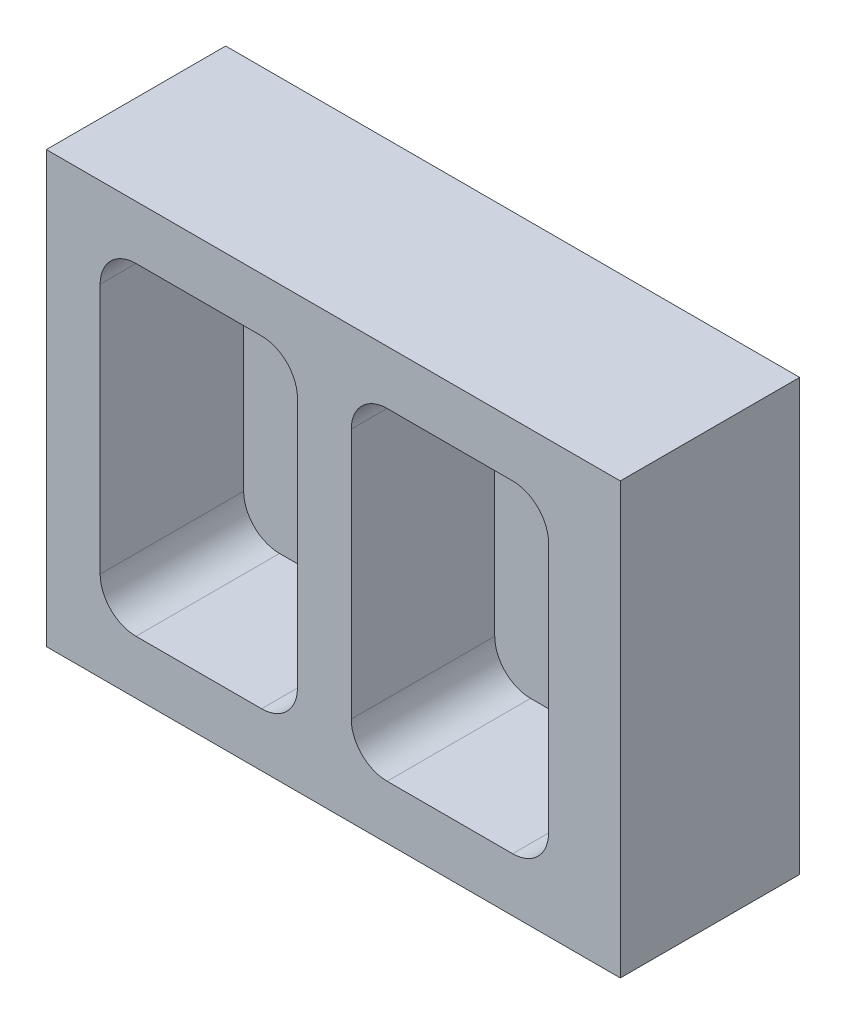
ISO-10303-21;
HEADER;
FILE_DESCRIPTION(('STEP AP214'),'2;1');
FILE_NAME('part.step','',(''),(''),'','','');
FILE_SCHEMA(('AUTOMOTIVE_DESIGN { 1 0 10303 214 1 1 1 1 }'));
ENDSEC;
DATA;
#1=APPLICATION_CONTEXT('core data for automotive mechanical design processes');
#2=APPLICATION_PROTOCOL_DEFINITION('international standard','automotive_design',2000,#1);
#3=PRODUCT_CONTEXT('',#1,'mechanical');
#4=PRODUCT('Part','Part','',(#3));
#5=PRODUCT_RELATED_PRODUCT_CATEGORY('part','',(#4));
#6=PRODUCT_DEFINITION_FORMATION('','',#4);
#7=PRODUCT_DEFINITION_CONTEXT('part definition',#1,'design');
#8=PRODUCT_DEFINITION('design','',#6,#7);
#9=PRODUCT_DEFINITION_SHAPE('','',#8);
#10=(LENGTH_UNIT() NAMED_UNIT(*) SI_UNIT(.MILLI.,.METRE.));
#11=(NAMED_UNIT(*) PLANE_ANGLE_UNIT() SI_UNIT($,.RADIAN.));
#12=(NAMED_UNIT(*) SI_UNIT($,.STERADIAN.) SOLID_ANGLE_UNIT());
#13=UNCERTAINTY_MEASURE_WITH_UNIT(LENGTH_MEASURE(1.E-05),#10,'distance_accuracy_value','');
#14=(GEOMETRIC_REPRESENTATION_CONTEXT(3) GLOBAL_UNCERTAINTY_ASSIGNED_CONTEXT((#13)) GLOBAL_UNIT_ASSIGNED_CONTEXT((#10,
#11,#12)) REPRESENTATION_CONTEXT('',''));
#15=CARTESIAN_POINT('',(0.,0.,0.));
#16=DIRECTION('',(0.,0.,1.));
#17=DIRECTION('',(1.,0.,0.));
#18=AXIS2_PLACEMENT_3D('',#15,#16,#17);
#19=CARTESIAN_POINT('',(-101.6,76.2,-63.5));
#20=DIRECTION('',(-1.,0.,0.));
#21=DIRECTION('',(0.,0.,1.));
#22=AXIS2_PLACEMENT_3D('',#19,#20,#21);
#23=PLANE('',#22);
#24=DIRECTION('',(0.,-1.,0.));
#25=VECTOR('',#24,1.);
#26=CARTESIAN_POINT('',(-101.6,76.2,0.));
#27=LINE('',#26,#25);
#28=CARTESIAN_POINT('',(-101.6,76.2,0.));
#29=VERTEX_POINT('',#28);
#30=CARTESIAN_POINT('',(-101.6,-76.2,0.));
#31=VERTEX_POINT('',#30);
#32=EDGE_CURVE('E293',#29,#31,#27,.T.);
#33=ORIENTED_EDGE('',*,*,#32,.F.);
#34=DIRECTION('',(0.,0.,1.));
#35=VECTOR('',#34,1.);
#36=CARTESIAN_POINT('',(-101.6,76.2,-63.5));
#37=LINE('',#36,#35);
#38=CARTESIAN_POINT('',(-101.6,76.2,-63.5));
#39=VERTEX_POINT('',#38);
#40=EDGE_CURVE('E11',#39,#29,#37,.T.);
#41=ORIENTED_EDGE('',*,*,#40,.F.);
#42=DIRECTION('',(0.,-1.,0.));
#43=VECTOR('',#42,1.);
#44=CARTESIAN_POINT('',(-101.6,76.2,-63.5));
#45=LINE('',#44,#43);
#46=CARTESIAN_POINT('',(-101.6,-76.2,-63.5));
#47=VERTEX_POINT('',#46);
#48=EDGE_CURVE('E318',#39,#47,#45,.T.);
#49=ORIENTED_EDGE('',*,*,#48,.T.);
#50=DIRECTION('',(0.,0.,1.));
#51=VECTOR('',#50,1.);
#52=CARTESIAN_POINT('',(-101.6,-76.2,-63.5));
#53=LINE('',#52,#51);
#54=EDGE_CURVE('E37',#47,#31,#53,.T.);
#55=ORIENTED_EDGE('',*,*,#54,.T.);
#56=EDGE_LOOP('',(#33,#41,#49,#55));
#57=FACE_BOUND('',#56,.T.);
#58=ADVANCED_FACE('F34',(#57),#23,.T.);
#59=CARTESIAN_POINT('',(-101.6,76.2,-63.5));
#60=DIRECTION('',(0.,1.,0.));
#61=DIRECTION('',(0.,0.,1.));
#62=AXIS2_PLACEMENT_3D('',#59,#60,#61);
#63=PLANE('',#62);
#64=DIRECTION('',(-1.,0.,0.));
#65=VECTOR('',#64,1.);
#66=CARTESIAN_POINT('',(-101.6,76.2,0.));
#67=LINE('',#66,#65);
#68=CARTESIAN_POINT('',(101.6,76.2,0.));
#69=VERTEX_POINT('',#68);
#70=EDGE_CURVE('E315',#69,#29,#67,.T.);
#71=ORIENTED_EDGE('',*,*,#70,.F.);
#72=DIRECTION('',(0.,0.,1.));
#73=VECTOR('',#72,1.);
#74=CARTESIAN_POINT('',(101.6,76.2,-63.5));
#75=LINE('',#74,#73);
#76=CARTESIAN_POINT('',(101.6,76.2,-63.5));
#77=VERTEX_POINT('',#76);
#78=EDGE_CURVE('E42',#77,#69,#75,.T.);
#79=ORIENTED_EDGE('',*,*,#78,.F.);
#80=DIRECTION('',(-1.,0.,0.));
#81=VECTOR('',#80,1.);
#82=CARTESIAN_POINT('',(-101.6,76.2,-63.5));
#83=LINE('',#82,#81);
#84=EDGE_CURVE('E327',#77,#39,#83,.T.);
#85=ORIENTED_EDGE('',*,*,#84,.T.);
#86=ORIENTED_EDGE('',*,*,#40,.T.);
#87=EDGE_LOOP('',(#71,#79,#85,#86));
#88=FACE_BOUND('',#87,.T.);
#89=ADVANCED_FACE('F342',(#88),#63,.T.);
#90=CARTESIAN_POINT('',(101.6,76.2,-63.5));
#91=DIRECTION('',(1.,0.,0.));
#92=DIRECTION('',(0.,0.,-1.));
#93=AXIS2_PLACEMENT_3D('',#90,#91,#92);
#94=PLANE('',#93);
#95=DIRECTION('',(0.,1.,0.));
#96=VECTOR('',#95,1.);
#97=CARTESIAN_POINT('',(101.6,76.2,0.));
#98=LINE('',#97,#96);
#99=CARTESIAN_POINT('',(101.6,-76.2,0.));
#100=VERTEX_POINT('',#99);
#101=EDGE_CURVE('E312',#100,#69,#98,.T.);
#102=ORIENTED_EDGE('',*,*,#101,.F.);
#103=DIRECTION('',(0.,0.,1.));
#104=VECTOR('',#103,1.);
#105=CARTESIAN_POINT('',(101.6,-76.2,-63.5));
#106=LINE('',#105,#104);
#107=CARTESIAN_POINT('',(101.6,-76.2,-63.5));
#108=VERTEX_POINT('',#107);
#109=EDGE_CURVE('E330',#108,#100,#106,.T.);
#110=ORIENTED_EDGE('',*,*,#109,.F.);
#111=DIRECTION('',(0.,1.,0.));
#112=VECTOR('',#111,1.);
#113=CARTESIAN_POINT('',(101.6,76.2,-63.5));
#114=LINE('',#113,#112);
#115=EDGE_CURVE('E324',#108,#77,#114,.T.);
#116=ORIENTED_EDGE('',*,*,#115,.T.);
#117=ORIENTED_EDGE('',*,*,#78,.T.);
#118=EDGE_LOOP('',(#102,#110,#116,#117));
#119=FACE_BOUND('',#118,.T.);
#120=ADVANCED_FACE('F348',(#119),#94,.T.);
#121=CARTESIAN_POINT('',(-101.6,-76.2,-63.5));
#122=DIRECTION('',(0.,-1.,0.));
#123=DIRECTION('',(0.,0.,-1.));
#124=AXIS2_PLACEMENT_3D('',#121,#122,#123);
#125=PLANE('',#124);
#126=DIRECTION('',(1.,0.,0.));
#127=VECTOR('',#126,1.);
#128=CARTESIAN_POINT('',(-101.6,-76.2,0.));
#129=LINE('',#128,#127);
#130=EDGE_CURVE('E309',#31,#100,#129,.T.);
#131=ORIENTED_EDGE('',*,*,#130,.F.);
#132=ORIENTED_EDGE('',*,*,#54,.F.);
#133=DIRECTION('',(1.,0.,0.));
#134=VECTOR('',#133,1.);
#135=CARTESIAN_POINT('',(-101.6,-76.2,-63.5));
#136=LINE('',#135,#134);
#137=EDGE_CURVE('E321',#47,#108,#136,.T.);
#138=ORIENTED_EDGE('',*,*,#137,.T.);
#139=ORIENTED_EDGE('',*,*,#109,.T.);
#140=EDGE_LOOP('',(#131,#132,#138,#139));
#141=FACE_BOUND('',#140,.T.);
#142=ADVANCED_FACE('F338',(#141),#125,.T.);
#143=CARTESIAN_POINT('',(-101.6,-76.2,-63.5));
#144=DIRECTION('',(0.,0.,1.));
#145=DIRECTION('',(1.,0.,0.));
#146=AXIS2_PLACEMENT_3D('',#143,#144,#145);
#147=PLANE('',#146);
#148=ORIENTED_EDGE('',*,*,#48,.F.);
#149=ORIENTED_EDGE('',*,*,#84,.F.);
#150=ORIENTED_EDGE('',*,*,#115,.F.);
#151=ORIENTED_EDGE('',*,*,#137,.F.);
#152=EDGE_LOOP('',(#148,#149,#150,#151));
#153=FACE_BOUND('',#152,.T.);
#154=ADVANCED_FACE('F345',(#153),#147,.F.);
#155=CARTESIAN_POINT('',(-101.6,-76.2,0.));
#156=DIRECTION('',(0.,0.,1.));
#157=DIRECTION('',(1.,0.,0.));
#158=AXIS2_PLACEMENT_3D('',#155,#156,#157);
#159=PLANE('',#158);
#160=CARTESIAN_POINT('',(19.05,-44.45,0.));
#161=DIRECTION('',(0.,0.,1.));
#162=DIRECTION('',(-1.,0.,0.));
#163=AXIS2_PLACEMENT_3D('',#160,#161,#162);
#164=CIRCLE('',#163,12.7);
#165=CARTESIAN_POINT('',(6.35,-44.4499999999999,0.));
#166=VERTEX_POINT('',#165);
#167=CARTESIAN_POINT('',(19.0500000000001,-57.15,0.));
#168=VERTEX_POINT('',#167);
#169=EDGE_CURVE('E50',#166,#168,#164,.T.);
#170=ORIENTED_EDGE('',*,*,#169,.F.);
#171=DIRECTION('',(0.,-1.,0.));
#172=VECTOR('',#171,1.);
#173=CARTESIAN_POINT('',(6.35,44.4499999999999,0.));
#174=LINE('',#173,#172);
#175=CARTESIAN_POINT('',(6.35,44.4499999999999,0.));
#176=VERTEX_POINT('',#175);
#177=EDGE_CURVE('E208',#176,#166,#174,.T.);
#178=ORIENTED_EDGE('',*,*,#177,.F.);
#179=CARTESIAN_POINT('',(19.05,44.45,0.));
#180=DIRECTION('',(0.,0.,1.));
#181=DIRECTION('',(-1.,0.,0.));
#182=AXIS2_PLACEMENT_3D('',#179,#180,#181);
#183=CIRCLE('',#182,12.7);
#184=CARTESIAN_POINT('',(19.0500000000001,57.15,0.));
#185=VERTEX_POINT('',#184);
#186=EDGE_CURVE('E205',#185,#176,#183,.T.);
#187=ORIENTED_EDGE('',*,*,#186,.F.);
#188=DIRECTION('',(-1.,0.,0.));
#189=VECTOR('',#188,1.);
#190=CARTESIAN_POINT('',(19.0500000000001,57.15,0.));
#191=LINE('',#190,#189);
#192=CARTESIAN_POINT('',(63.5,57.15,0.));
#193=VERTEX_POINT('',#192);
#194=EDGE_CURVE('E202',#193,#185,#191,.T.);
#195=ORIENTED_EDGE('',*,*,#194,.F.);
#196=CARTESIAN_POINT('',(63.5,44.45,0.));
#197=DIRECTION('',(0.,0.,1.));
#198=DIRECTION('',(1.,0.,0.));
#199=AXIS2_PLACEMENT_3D('',#196,#197,#198);
#200=CIRCLE('',#199,12.7);
#201=CARTESIAN_POINT('',(76.2,44.45,0.));
#202=VERTEX_POINT('',#201);
#203=EDGE_CURVE('E196',#202,#193,#200,.T.);
#204=ORIENTED_EDGE('',*,*,#203,.F.);
#205=DIRECTION('',(0.,1.,0.));
#206=VECTOR('',#205,1.);
#207=CARTESIAN_POINT('',(76.2,44.45,0.));
#208=LINE('',#207,#206);
#209=CARTESIAN_POINT('',(76.2,-44.45,0.));
#210=VERTEX_POINT('',#209);
#211=EDGE_CURVE('E194',#210,#202,#208,.T.);
#212=ORIENTED_EDGE('',*,*,#211,.F.);
#213=CARTESIAN_POINT('',(63.5,-44.45,0.));
#214=DIRECTION('',(0.,0.,1.));
#215=DIRECTION('',(-1.,0.,0.));
#216=AXIS2_PLACEMENT_3D('',#213,#214,#215);
#217=CIRCLE('',#216,12.7);
#218=CARTESIAN_POINT('',(63.5,-57.15,0.));
#219=VERTEX_POINT('',#218);
#220=EDGE_CURVE('E175',#219,#210,#217,.T.);
#221=ORIENTED_EDGE('',*,*,#220,.F.);
#222=DIRECTION('',(1.,0.,0.));
#223=VECTOR('',#222,1.);
#224=CARTESIAN_POINT('',(19.0500000000001,-57.15,0.));
#225=LINE('',#224,#223);
#226=EDGE_CURVE('E186',#168,#219,#225,.T.);
#227=ORIENTED_EDGE('',*,*,#226,.F.);
#228=EDGE_LOOP('',(#170,#178,#187,#195,#204,#212,#221,#227));
#229=FACE_BOUND('',#228,.T.);
#230=CARTESIAN_POINT('',(-69.85,44.45,0.));
#231=DIRECTION('',(0.,0.,1.));
#232=DIRECTION('',(-1.,0.,0.));
#233=AXIS2_PLACEMENT_3D('',#230,#231,#232);
#234=CIRCLE('',#233,12.7);
#235=CARTESIAN_POINT('',(-69.8499999999999,57.15,0.));
#236=VERTEX_POINT('',#235);
#237=CARTESIAN_POINT('',(-82.55,44.4499999999999,0.));
#238=VERTEX_POINT('',#237);
#239=EDGE_CURVE('E58',#236,#238,#234,.T.);
#240=ORIENTED_EDGE('',*,*,#239,.F.);
#241=DIRECTION('',(-1.,0.,0.));
#242=VECTOR('',#241,1.);
#243=CARTESIAN_POINT('',(-69.8499999999999,57.15,0.));
#244=LINE('',#243,#242);
#245=CARTESIAN_POINT('',(-25.4000000000001,57.15,0.));
#246=VERTEX_POINT('',#245);
#247=EDGE_CURVE('E263',#246,#236,#244,.T.);
#248=ORIENTED_EDGE('',*,*,#247,.F.);
#249=CARTESIAN_POINT('',(-25.4,44.45,0.));
#250=DIRECTION('',(0.,0.,1.));
#251=DIRECTION('',(1.,0.,0.));
#252=AXIS2_PLACEMENT_3D('',#249,#250,#251);
#253=CIRCLE('',#252,12.7);
#254=CARTESIAN_POINT('',(-12.7,44.4499999999999,0.));
#255=VERTEX_POINT('',#254);
#256=EDGE_CURVE('E260',#255,#246,#253,.T.);
#257=ORIENTED_EDGE('',*,*,#256,.F.);
#258=DIRECTION('',(0.,1.,0.));
#259=VECTOR('',#258,1.);
#260=CARTESIAN_POINT('',(-12.7,44.4499999999999,0.));
#261=LINE('',#260,#259);
#262=CARTESIAN_POINT('',(-12.7,-44.4499999999999,0.));
#263=VERTEX_POINT('',#262);
#264=EDGE_CURVE('E257',#263,#255,#261,.T.);
#265=ORIENTED_EDGE('',*,*,#264,.F.);
#266=CARTESIAN_POINT('',(-25.4,-44.45,0.));
#267=DIRECTION('',(0.,0.,1.));
#268=DIRECTION('',(-1.,0.,0.));
#269=AXIS2_PLACEMENT_3D('',#266,#267,#268);
#270=CIRCLE('',#269,12.7);
#271=CARTESIAN_POINT('',(-25.4000000000001,-57.15,0.));
#272=VERTEX_POINT('',#271);
#273=EDGE_CURVE('E254',#272,#263,#270,.T.);
#274=ORIENTED_EDGE('',*,*,#273,.F.);
#275=DIRECTION('',(1.,0.,0.));
#276=VECTOR('',#275,1.);
#277=CARTESIAN_POINT('',(-69.8499999999999,-57.15,0.));
#278=LINE('',#277,#276);
#279=CARTESIAN_POINT('',(-69.8499999999999,-57.15,0.));
#280=VERTEX_POINT('',#279);
#281=EDGE_CURVE('E251',#280,#272,#278,.T.);
#282=ORIENTED_EDGE('',*,*,#281,.F.);
#283=CARTESIAN_POINT('',(-69.85,-44.45,0.));
#284=DIRECTION('',(0.,0.,1.));
#285=DIRECTION('',(-1.,0.,0.));
#286=AXIS2_PLACEMENT_3D('',#283,#284,#285);
#287=CIRCLE('',#286,12.7);
#288=CARTESIAN_POINT('',(-82.55,-44.4499999999999,0.));
#289=VERTEX_POINT('',#288);
#290=EDGE_CURVE('E248',#289,#280,#287,.T.);
#291=ORIENTED_EDGE('',*,*,#290,.F.);
#292=DIRECTION('',(0.,-1.,0.));
#293=VECTOR('',#292,1.);
#294=CARTESIAN_POINT('',(-82.55,44.4499999999999,0.));
#295=LINE('',#294,#293);
#296=EDGE_CURVE('E245',#238,#289,#295,.T.);
#297=ORIENTED_EDGE('',*,*,#296,.F.);
#298=EDGE_LOOP('',(#240,#248,#257,#265,#274,#282,#291,#297));
#299=FACE_BOUND('',#298,.T.);
#300=ORIENTED_EDGE('',*,*,#32,.T.);
#301=ORIENTED_EDGE('',*,*,#130,.T.);
#302=ORIENTED_EDGE('',*,*,#101,.T.);
#303=ORIENTED_EDGE('',*,*,#70,.T.);
#304=EDGE_LOOP('',(#300,#301,#302,#303));
#305=FACE_BOUND('',#304,.T.);
#306=ADVANCED_FACE('F190',(#229,#299,#305),#159,.T.);
#307=CARTESIAN_POINT('',(-69.85,44.45,-50.8));
#308=DIRECTION('',(0.,0.,1.));
#309=DIRECTION('',(1.,0.,0.));
#310=AXIS2_PLACEMENT_3D('',#307,#308,#309);
#311=CYLINDRICAL_SURFACE('',#310,12.7);
#312=ORIENTED_EDGE('',*,*,#239,.T.);
#313=DIRECTION('',(0.,0.,1.));
#314=VECTOR('',#313,1.);
#315=CARTESIAN_POINT('',(-82.55,44.4499999999999,-50.8));
#316=LINE('',#315,#314);
#317=CARTESIAN_POINT('',(-82.55,44.4499999999999,-50.8));
#318=VERTEX_POINT('',#317);
#319=EDGE_CURVE('E290',#318,#238,#316,.T.);
#320=ORIENTED_EDGE('',*,*,#319,.F.);
#321=CARTESIAN_POINT('',(-69.85,44.45,-50.8));
#322=DIRECTION('',(0.,0.,1.));
#323=DIRECTION('',(-1.,0.,0.));
#324=AXIS2_PLACEMENT_3D('',#321,#322,#323);
#325=CIRCLE('',#324,12.7);
#326=CARTESIAN_POINT('',(-69.8499999999999,57.15,-50.8));
#327=VERTEX_POINT('',#326);
#328=EDGE_CURVE('E266',#327,#318,#325,.T.);
#329=ORIENTED_EDGE('',*,*,#328,.F.);
#330=DIRECTION('',(0.,0.,1.));
#331=VECTOR('',#330,1.);
#332=CARTESIAN_POINT('',(-69.8499999999999,57.15,-50.8));
#333=LINE('',#332,#331);
#334=EDGE_CURVE('E291',#327,#236,#333,.T.);
#335=ORIENTED_EDGE('',*,*,#334,.T.);
#336=EDGE_LOOP('',(#312,#320,#329,#335));
#337=FACE_BOUND('',#336,.T.);
#338=ADVANCED_FACE('F391',(#337),#311,.F.);
#339=CARTESIAN_POINT('',(-69.8499999999999,57.15,-50.8));
#340=DIRECTION('',(0.,1.,0.));
#341=DIRECTION('',(0.,0.,1.));
#342=AXIS2_PLACEMENT_3D('',#339,#340,#341);
#343=PLANE('',#342);
#344=ORIENTED_EDGE('',*,*,#247,.T.);
#345=ORIENTED_EDGE('',*,*,#334,.F.);
#346=DIRECTION('',(-1.,0.,0.));
#347=VECTOR('',#346,1.);
#348=CARTESIAN_POINT('',(-69.8499999999999,57.15,-50.8));
#349=LINE('',#348,#347);
#350=CARTESIAN_POINT('',(-25.4000000000001,57.15,-50.8));
#351=VERTEX_POINT('',#350);
#352=EDGE_CURVE('E287',#351,#327,#349,.T.);
#353=ORIENTED_EDGE('',*,*,#352,.F.);
#354=DIRECTION('',(0.,0.,1.));
#355=VECTOR('',#354,1.);
#356=CARTESIAN_POINT('',(-25.4000000000001,57.15,-50.8));
#357=LINE('',#356,#355);
#358=EDGE_CURVE('E294',#351,#246,#357,.T.);
#359=ORIENTED_EDGE('',*,*,#358,.T.);
#360=EDGE_LOOP('',(#344,#345,#353,#359));
#361=FACE_BOUND('',#360,.T.);
#362=ADVANCED_FACE('F399',(#361),#343,.F.);
#363=CARTESIAN_POINT('',(-25.4,44.45,-50.8));
#364=DIRECTION('',(0.,0.,1.));
#365=DIRECTION('',(1.,0.,0.));
#366=AXIS2_PLACEMENT_3D('',#363,#364,#365);
#367=CYLINDRICAL_SURFACE('',#366,12.7);
#368=ORIENTED_EDGE('',*,*,#256,.T.);
#369=ORIENTED_EDGE('',*,*,#358,.F.);
#370=CARTESIAN_POINT('',(-25.4,44.45,-50.8));
#371=DIRECTION('',(0.,0.,1.));
#372=DIRECTION('',(1.,0.,0.));
#373=AXIS2_PLACEMENT_3D('',#370,#371,#372);
#374=CIRCLE('',#373,12.7);
#375=CARTESIAN_POINT('',(-12.7,44.4499999999999,-50.8));
#376=VERTEX_POINT('',#375);
#377=EDGE_CURVE('E284',#376,#351,#374,.T.);
#378=ORIENTED_EDGE('',*,*,#377,.F.);
#379=DIRECTION('',(0.,0.,1.));
#380=VECTOR('',#379,1.);
#381=CARTESIAN_POINT('',(-12.7,44.4499999999999,-50.8));
#382=LINE('',#381,#380);
#383=EDGE_CURVE('E296',#376,#255,#382,.T.);
#384=ORIENTED_EDGE('',*,*,#383,.T.);
#385=EDGE_LOOP('',(#368,#369,#378,#384));
#386=FACE_BOUND('',#385,.T.);
#387=ADVANCED_FACE('F408',(#386),#367,.F.);
#388=CARTESIAN_POINT('',(-12.7,44.4499999999999,-50.8));
#389=DIRECTION('',(1.,0.,0.));
#390=DIRECTION('',(0.,0.,-1.));
#391=AXIS2_PLACEMENT_3D('',#388,#389,#390);
#392=PLANE('',#391);
#393=ORIENTED_EDGE('',*,*,#264,.T.);
#394=ORIENTED_EDGE('',*,*,#383,.F.);
#395=DIRECTION('',(0.,1.,0.));
#396=VECTOR('',#395,1.);
#397=CARTESIAN_POINT('',(-12.7,44.4499999999999,-50.8));
#398=LINE('',#397,#396);
#399=CARTESIAN_POINT('',(-12.7,-44.4499999999999,-50.8));
#400=VERTEX_POINT('',#399);
#401=EDGE_CURVE('E281',#400,#376,#398,.T.);
#402=ORIENTED_EDGE('',*,*,#401,.F.);
#403=DIRECTION('',(0.,0.,1.));
#404=VECTOR('',#403,1.);
#405=CARTESIAN_POINT('',(-12.7,-44.4499999999999,-50.8));
#406=LINE('',#405,#404);
#407=EDGE_CURVE('E298',#400,#263,#406,.T.);
#408=ORIENTED_EDGE('',*,*,#407,.T.);
#409=EDGE_LOOP('',(#393,#394,#402,#408));
#410=FACE_BOUND('',#409,.T.);
#411=ADVANCED_FACE('F418',(#410),#392,.F.);
#412=CARTESIAN_POINT('',(-25.4,-44.45,-50.8));
#413=DIRECTION('',(0.,0.,1.));
#414=DIRECTION('',(1.,0.,0.));
#415=AXIS2_PLACEMENT_3D('',#412,#413,#414);
#416=CYLINDRICAL_SURFACE('',#415,12.7);
#417=ORIENTED_EDGE('',*,*,#273,.T.);
#418=ORIENTED_EDGE('',*,*,#407,.F.);
#419=CARTESIAN_POINT('',(-25.4,-44.45,-50.8));
#420=DIRECTION('',(0.,0.,1.));
#421=DIRECTION('',(-1.,0.,0.));
#422=AXIS2_PLACEMENT_3D('',#419,#420,#421);
#423=CIRCLE('',#422,12.7);
#424=CARTESIAN_POINT('',(-25.4000000000001,-57.15,-50.8));
#425=VERTEX_POINT('',#424);
#426=EDGE_CURVE('E278',#425,#400,#423,.T.);
#427=ORIENTED_EDGE('',*,*,#426,.F.);
#428=DIRECTION('',(0.,0.,1.));
#429=VECTOR('',#428,1.);
#430=CARTESIAN_POINT('',(-25.4000000000001,-57.15,-50.8));
#431=LINE('',#430,#429);
#432=EDGE_CURVE('E300',#425,#272,#431,.T.);
#433=ORIENTED_EDGE('',*,*,#432,.T.);
#434=EDGE_LOOP('',(#417,#418,#427,#433));
#435=FACE_BOUND('',#434,.T.);
#436=ADVANCED_FACE('F428',(#435),#416,.F.);
#437=CARTESIAN_POINT('',(-69.8499999999999,-57.15,-50.8));
#438=DIRECTION('',(0.,-1.,0.));
#439=DIRECTION('',(0.,0.,-1.));
#440=AXIS2_PLACEMENT_3D('',#437,#438,#439);
#441=PLANE('',#440);
#442=ORIENTED_EDGE('',*,*,#281,.T.);
#443=ORIENTED_EDGE('',*,*,#432,.F.);
#444=DIRECTION('',(1.,0.,0.));
#445=VECTOR('',#444,1.);
#446=CARTESIAN_POINT('',(-69.8499999999999,-57.15,-50.8));
#447=LINE('',#446,#445);
#448=CARTESIAN_POINT('',(-69.8499999999999,-57.15,-50.8));
#449=VERTEX_POINT('',#448);
#450=EDGE_CURVE('E275',#449,#425,#447,.T.);
#451=ORIENTED_EDGE('',*,*,#450,.F.);
#452=DIRECTION('',(0.,0.,1.));
#453=VECTOR('',#452,1.);
#454=CARTESIAN_POINT('',(-69.8499999999999,-57.15,-50.8));
#455=LINE('',#454,#453);
#456=EDGE_CURVE('E302',#449,#280,#455,.T.);
#457=ORIENTED_EDGE('',*,*,#456,.T.);
#458=EDGE_LOOP('',(#442,#443,#451,#457));
#459=FACE_BOUND('',#458,.T.);
#460=ADVANCED_FACE('F438',(#459),#441,.F.);
#461=CARTESIAN_POINT('',(-69.85,-44.45,-50.8));
#462=DIRECTION('',(0.,0.,1.));
#463=DIRECTION('',(1.,0.,0.));
#464=AXIS2_PLACEMENT_3D('',#461,#462,#463);
#465=CYLINDRICAL_SURFACE('',#464,12.7);
#466=ORIENTED_EDGE('',*,*,#290,.T.);
#467=ORIENTED_EDGE('',*,*,#456,.F.);
#468=CARTESIAN_POINT('',(-69.85,-44.45,-50.8));
#469=DIRECTION('',(0.,0.,1.));
#470=DIRECTION('',(-1.,0.,0.));
#471=AXIS2_PLACEMENT_3D('',#468,#469,#470);
#472=CIRCLE('',#471,12.7);
#473=CARTESIAN_POINT('',(-82.55,-44.4499999999999,-50.8));
#474=VERTEX_POINT('',#473);
#475=EDGE_CURVE('E272',#474,#449,#472,.T.);
#476=ORIENTED_EDGE('',*,*,#475,.F.);
#477=DIRECTION('',(0.,0.,1.));
#478=VECTOR('',#477,1.);
#479=CARTESIAN_POINT('',(-82.55,-44.4499999999999,-50.8));
#480=LINE('',#479,#478);
#481=EDGE_CURVE('E304',#474,#289,#480,.T.);
#482=ORIENTED_EDGE('',*,*,#481,.T.);
#483=EDGE_LOOP('',(#466,#467,#476,#482));
#484=FACE_BOUND('',#483,.T.);
#485=ADVANCED_FACE('F448',(#484),#465,.F.);
#486=CARTESIAN_POINT('',(-82.55,44.4499999999999,-50.8));
#487=DIRECTION('',(-1.,0.,0.));
#488=DIRECTION('',(0.,0.,1.));
#489=AXIS2_PLACEMENT_3D('',#486,#487,#488);
#490=PLANE('',#489);
#491=ORIENTED_EDGE('',*,*,#296,.T.);
#492=ORIENTED_EDGE('',*,*,#481,.F.);
#493=DIRECTION('',(0.,-1.,0.));
#494=VECTOR('',#493,1.);
#495=CARTESIAN_POINT('',(-82.55,44.4499999999999,-50.8));
#496=LINE('',#495,#494);
#497=EDGE_CURVE('E269',#318,#474,#496,.T.);
#498=ORIENTED_EDGE('',*,*,#497,.F.);
#499=ORIENTED_EDGE('',*,*,#319,.T.);
#500=EDGE_LOOP('',(#491,#492,#498,#499));
#501=FACE_BOUND('',#500,.T.);
#502=ADVANCED_FACE('F458',(#501),#490,.F.);
#503=CARTESIAN_POINT('',(-69.85,44.45,-50.8));
#504=DIRECTION('',(0.,0.,-1.));
#505=DIRECTION('',(-1.,0.,0.));
#506=AXIS2_PLACEMENT_3D('',#503,#504,#505);
#507=PLANE('',#506);
#508=ORIENTED_EDGE('',*,*,#328,.T.);
#509=ORIENTED_EDGE('',*,*,#497,.T.);
#510=ORIENTED_EDGE('',*,*,#475,.T.);
#511=ORIENTED_EDGE('',*,*,#450,.T.);
#512=ORIENTED_EDGE('',*,*,#426,.T.);
#513=ORIENTED_EDGE('',*,*,#401,.T.);
#514=ORIENTED_EDGE('',*,*,#377,.T.);
#515=ORIENTED_EDGE('',*,*,#352,.T.);
#516=EDGE_LOOP('',(#508,#509,#510,#511,#512,#513,#514,#515));
#517=FACE_BOUND('',#516,.T.);
#518=ADVANCED_FACE('F468',(#517),#507,.F.);
#519=CARTESIAN_POINT('',(19.05,-44.45,-50.8));
#520=DIRECTION('',(0.,0.,1.));
#521=DIRECTION('',(1.,0.,0.));
#522=AXIS2_PLACEMENT_3D('',#519,#520,#521);
#523=CYLINDRICAL_SURFACE('',#522,12.7);
#524=ORIENTED_EDGE('',*,*,#169,.T.);
#525=DIRECTION('',(0.,0.,1.));
#526=VECTOR('',#525,1.);
#527=CARTESIAN_POINT('',(19.0500000000001,-57.15,-50.8));
#528=LINE('',#527,#526);
#529=CARTESIAN_POINT('',(19.0500000000001,-57.15,-50.8));
#530=VERTEX_POINT('',#529);
#531=EDGE_CURVE('E183',#530,#168,#528,.T.);
#532=ORIENTED_EDGE('',*,*,#531,.F.);
#533=CARTESIAN_POINT('',(19.05,-44.45,-50.8));
#534=DIRECTION('',(0.,0.,1.));
#535=DIRECTION('',(-1.,0.,0.));
#536=AXIS2_PLACEMENT_3D('',#533,#534,#535);
#537=CIRCLE('',#536,12.7);
#538=CARTESIAN_POINT('',(6.35,-44.4499999999999,-50.8));
#539=VERTEX_POINT('',#538);
#540=EDGE_CURVE('E211',#539,#530,#537,.T.);
#541=ORIENTED_EDGE('',*,*,#540,.F.);
#542=DIRECTION('',(0.,0.,1.));
#543=VECTOR('',#542,1.);
#544=CARTESIAN_POINT('',(6.35,-44.4499999999999,-50.8));
#545=LINE('',#544,#543);
#546=EDGE_CURVE('E232',#539,#166,#545,.T.);
#547=ORIENTED_EDGE('',*,*,#546,.T.);
#548=EDGE_LOOP('',(#524,#532,#541,#547));
#549=FACE_BOUND('',#548,.T.);
#550=ADVANCED_FACE('F478',(#549),#523,.F.);
#551=CARTESIAN_POINT('',(6.35,44.4499999999999,-50.8));
#552=DIRECTION('',(-1.,0.,0.));
#553=DIRECTION('',(0.,0.,1.));
#554=AXIS2_PLACEMENT_3D('',#551,#552,#553);
#555=PLANE('',#554);
#556=ORIENTED_EDGE('',*,*,#177,.T.);
#557=ORIENTED_EDGE('',*,*,#546,.F.);
#558=DIRECTION('',(0.,-1.,0.));
#559=VECTOR('',#558,1.);
#560=CARTESIAN_POINT('',(6.35,44.4499999999999,-50.8));
#561=LINE('',#560,#559);
#562=CARTESIAN_POINT('',(6.35,44.4499999999999,-50.8));
#563=VERTEX_POINT('',#562);
#564=EDGE_CURVE('E229',#563,#539,#561,.T.);
#565=ORIENTED_EDGE('',*,*,#564,.F.);
#566=DIRECTION('',(0.,0.,1.));
#567=VECTOR('',#566,1.);
#568=CARTESIAN_POINT('',(6.35,44.4499999999999,-50.8));
#569=LINE('',#568,#567);
#570=EDGE_CURVE('E234',#563,#176,#569,.T.);
#571=ORIENTED_EDGE('',*,*,#570,.T.);
#572=EDGE_LOOP('',(#556,#557,#565,#571));
#573=FACE_BOUND('',#572,.T.);
#574=ADVANCED_FACE('F488',(#573),#555,.F.);
#575=CARTESIAN_POINT('',(19.05,44.45,-50.8));
#576=DIRECTION('',(0.,0.,1.));
#577=DIRECTION('',(1.,0.,0.));
#578=AXIS2_PLACEMENT_3D('',#575,#576,#577);
#579=CYLINDRICAL_SURFACE('',#578,12.7);
#580=ORIENTED_EDGE('',*,*,#186,.T.);
#581=ORIENTED_EDGE('',*,*,#570,.F.);
#582=CARTESIAN_POINT('',(19.05,44.45,-50.8));
#583=DIRECTION('',(0.,0.,1.));
#584=DIRECTION('',(-1.,0.,0.));
#585=AXIS2_PLACEMENT_3D('',#582,#583,#584);
#586=CIRCLE('',#585,12.7);
#587=CARTESIAN_POINT('',(19.0500000000001,57.15,-50.8));
#588=VERTEX_POINT('',#587);
#589=EDGE_CURVE('E226',#588,#563,#586,.T.);
#590=ORIENTED_EDGE('',*,*,#589,.F.);
#591=DIRECTION('',(0.,0.,1.));
#592=VECTOR('',#591,1.);
#593=CARTESIAN_POINT('',(19.0500000000001,57.15,-50.8));
#594=LINE('',#593,#592);
#595=EDGE_CURVE('E236',#588,#185,#594,.T.);
#596=ORIENTED_EDGE('',*,*,#595,.T.);
#597=EDGE_LOOP('',(#580,#581,#590,#596));
#598=FACE_BOUND('',#597,.T.);
#599=ADVANCED_FACE('F497',(#598),#579,.F.);
#600=CARTESIAN_POINT('',(19.0500000000001,57.15,-50.8));
#601=DIRECTION('',(0.,1.,0.));
#602=DIRECTION('',(-1.,0.,0.));
#603=AXIS2_PLACEMENT_3D('',#600,#601,#602);
#604=PLANE('',#603);
#605=ORIENTED_EDGE('',*,*,#194,.T.);
#606=ORIENTED_EDGE('',*,*,#595,.F.);
#607=DIRECTION('',(-1.,0.,0.));
#608=VECTOR('',#607,1.);
#609=CARTESIAN_POINT('',(19.0500000000001,57.15,-50.8));
#610=LINE('',#609,#608);
#611=CARTESIAN_POINT('',(63.5,57.15,-50.8));
#612=VERTEX_POINT('',#611);
#613=EDGE_CURVE('E223',#612,#588,#610,.T.);
#614=ORIENTED_EDGE('',*,*,#613,.F.);
#615=DIRECTION('',(0.,0.,1.));
#616=VECTOR('',#615,1.);
#617=CARTESIAN_POINT('',(63.5,57.15,-50.8));
#618=LINE('',#617,#616);
#619=EDGE_CURVE('E238',#612,#193,#618,.T.);
#620=ORIENTED_EDGE('',*,*,#619,.T.);
#621=EDGE_LOOP('',(#605,#606,#614,#620));
#622=FACE_BOUND('',#621,.T.);
#623=ADVANCED_FACE('F507',(#622),#604,.F.);
#624=CARTESIAN_POINT('',(63.5,44.45,-50.8));
#625=DIRECTION('',(0.,0.,1.));
#626=DIRECTION('',(1.,0.,0.));
#627=AXIS2_PLACEMENT_3D('',#624,#625,#626);
#628=CYLINDRICAL_SURFACE('',#627,12.7);
#629=ORIENTED_EDGE('',*,*,#203,.T.);
#630=ORIENTED_EDGE('',*,*,#619,.F.);
#631=CARTESIAN_POINT('',(63.5,44.45,-50.8));
#632=DIRECTION('',(0.,0.,1.));
#633=DIRECTION('',(1.,0.,0.));
#634=AXIS2_PLACEMENT_3D('',#631,#632,#633);
#635=CIRCLE('',#634,12.7);
#636=CARTESIAN_POINT('',(76.2,44.45,-50.8));
#637=VERTEX_POINT('',#636);
#638=EDGE_CURVE('E220',#637,#612,#635,.T.);
#639=ORIENTED_EDGE('',*,*,#638,.F.);
#640=DIRECTION('',(0.,0.,1.));
#641=VECTOR('',#640,1.);
#642=CARTESIAN_POINT('',(76.2,44.45,-50.8));
#643=LINE('',#642,#641);
#644=EDGE_CURVE('E240',#637,#202,#643,.T.);
#645=ORIENTED_EDGE('',*,*,#644,.T.);
#646=EDGE_LOOP('',(#629,#630,#639,#645));
#647=FACE_BOUND('',#646,.T.);
#648=ADVANCED_FACE('F517',(#647),#628,.F.);
#649=CARTESIAN_POINT('',(76.2,44.45,-50.8));
#650=DIRECTION('',(1.,0.,0.));
#651=DIRECTION('',(0.,0.,-1.));
#652=AXIS2_PLACEMENT_3D('',#649,#650,#651);
#653=PLANE('',#652);
#654=ORIENTED_EDGE('',*,*,#211,.T.);
#655=ORIENTED_EDGE('',*,*,#644,.F.);
#656=DIRECTION('',(0.,1.,0.));
#657=VECTOR('',#656,1.);
#658=CARTESIAN_POINT('',(76.2,44.45,-50.8));
#659=LINE('',#658,#657);
#660=CARTESIAN_POINT('',(76.2,-44.45,-50.8));
#661=VERTEX_POINT('',#660);
#662=EDGE_CURVE('E217',#661,#637,#659,.T.);
#663=ORIENTED_EDGE('',*,*,#662,.F.);
#664=DIRECTION('',(0.,0.,1.));
#665=VECTOR('',#664,1.);
#666=CARTESIAN_POINT('',(76.2,-44.45,-50.8));
#667=LINE('',#666,#665);
#668=EDGE_CURVE('E182',#661,#210,#667,.T.);
#669=ORIENTED_EDGE('',*,*,#668,.T.);
#670=EDGE_LOOP('',(#654,#655,#663,#669));
#671=FACE_BOUND('',#670,.T.);
#672=ADVANCED_FACE('F527',(#671),#653,.F.);
#673=CARTESIAN_POINT('',(63.5,-44.45,-50.8));
#674=DIRECTION('',(0.,0.,1.));
#675=DIRECTION('',(1.,0.,0.));
#676=AXIS2_PLACEMENT_3D('',#673,#674,#675);
#677=CYLINDRICAL_SURFACE('',#676,12.7);
#678=ORIENTED_EDGE('',*,*,#220,.T.);
#679=ORIENTED_EDGE('',*,*,#668,.F.);
#680=CARTESIAN_POINT('',(63.5,-44.45,-50.8));
#681=DIRECTION('',(0.,0.,1.));
#682=DIRECTION('',(-1.,0.,0.));
#683=AXIS2_PLACEMENT_3D('',#680,#681,#682);
#684=CIRCLE('',#683,12.7);
#685=CARTESIAN_POINT('',(63.5,-57.15,-50.8));
#686=VERTEX_POINT('',#685);
#687=EDGE_CURVE('E178',#686,#661,#684,.T.);
#688=ORIENTED_EDGE('',*,*,#687,.F.);
#689=DIRECTION('',(0.,0.,1.));
#690=VECTOR('',#689,1.);
#691=CARTESIAN_POINT('',(63.5,-57.15,-50.8));
#692=LINE('',#691,#690);
#693=EDGE_CURVE('E171',#686,#219,#692,.T.);
#694=ORIENTED_EDGE('',*,*,#693,.T.);
#695=EDGE_LOOP('',(#678,#679,#688,#694));
#696=FACE_BOUND('',#695,.T.);
#697=ADVANCED_FACE('F173',(#696),#677,.F.);
#698=CARTESIAN_POINT('',(19.0500000000001,-57.15,-50.8));
#699=DIRECTION('',(0.,-1.,0.));
#700=DIRECTION('',(1.,0.,0.));
#701=AXIS2_PLACEMENT_3D('',#698,#699,#700);
#702=PLANE('',#701);
#703=ORIENTED_EDGE('',*,*,#226,.T.);
#704=ORIENTED_EDGE('',*,*,#693,.F.);
#705=DIRECTION('',(1.,0.,0.));
#706=VECTOR('',#705,1.);
#707=CARTESIAN_POINT('',(19.0500000000001,-57.15,-50.8));
#708=LINE('',#707,#706);
#709=EDGE_CURVE('E214',#530,#686,#708,.T.);
#710=ORIENTED_EDGE('',*,*,#709,.F.);
#711=ORIENTED_EDGE('',*,*,#531,.T.);
#712=EDGE_LOOP('',(#703,#704,#710,#711));
#713=FACE_BOUND('',#712,.T.);
#714=ADVANCED_FACE('F187',(#713),#702,.F.);
#715=CARTESIAN_POINT('',(19.05,-44.45,-50.8));
#716=DIRECTION('',(0.,0.,-1.));
#717=DIRECTION('',(-1.,0.,0.));
#718=AXIS2_PLACEMENT_3D('',#715,#716,#717);
#719=PLANE('',#718);
#720=ORIENTED_EDGE('',*,*,#540,.T.);
#721=ORIENTED_EDGE('',*,*,#709,.T.);
#722=ORIENTED_EDGE('',*,*,#687,.T.);
#723=ORIENTED_EDGE('',*,*,#662,.T.);
#724=ORIENTED_EDGE('',*,*,#638,.T.);
#725=ORIENTED_EDGE('',*,*,#613,.T.);
#726=ORIENTED_EDGE('',*,*,#589,.T.);
#727=ORIENTED_EDGE('',*,*,#564,.T.);
#728=EDGE_LOOP('',(#720,#721,#722,#723,#724,#725,#726,#727));
#729=FACE_BOUND('',#728,.T.);
#730=ADVANCED_FACE('F554',(#729),#719,.F.);
#731=CLOSED_SHELL('',(#58,#89,#120,#142,#154,#306,#338,#362,#387,#411,#436,#460,#485,#502,#518,
#550,#574,#599,#623,#648,#672,#697,#714,#730));
#732=MANIFOLD_SOLID_BREP('B2',#731);
#733=ADVANCED_BREP_SHAPE_REPRESENTATION('',(#18,#732),#14);
#734=SHAPE_DEFINITION_REPRESENTATION(#9,#733);
ENDSEC;
END-ISO-10303-21;
